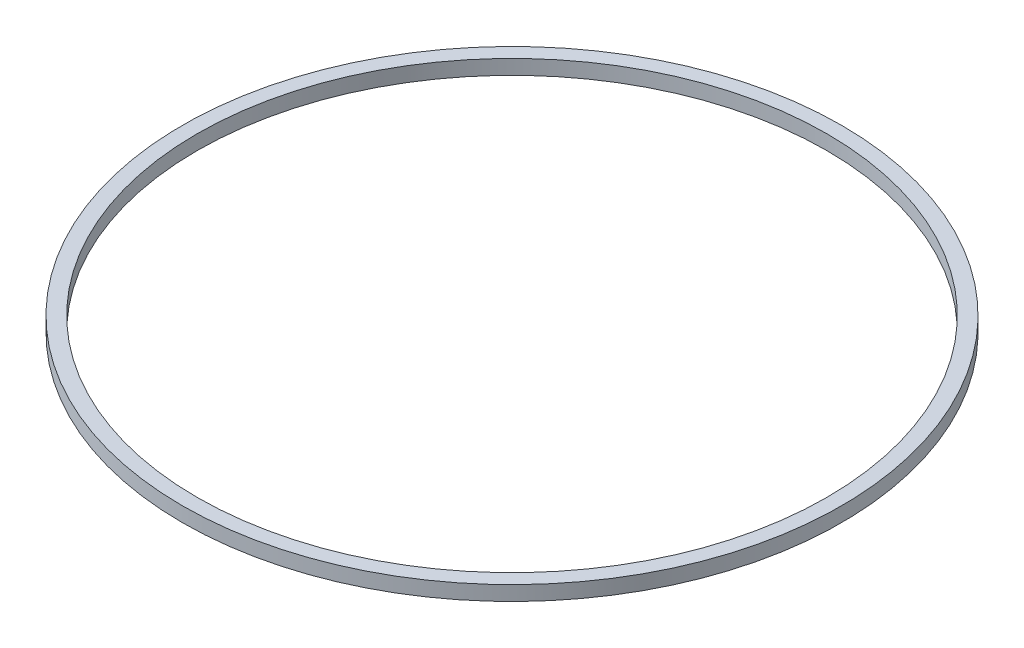
ISO-10303-21;
HEADER;
FILE_DESCRIPTION(('STEP AP214'),'2;1');
FILE_NAME('part.step','',(''),(''),'','','');
FILE_SCHEMA(('AUTOMOTIVE_DESIGN { 1 0 10303 214 1 1 1 1 }'));
ENDSEC;
DATA;
#1=APPLICATION_CONTEXT('core data for automotive mechanical design processes');
#2=APPLICATION_PROTOCOL_DEFINITION('international standard','automotive_design',2000,#1);
#3=PRODUCT_CONTEXT('',#1,'mechanical');
#4=PRODUCT('Part','Part','',(#3));
#5=PRODUCT_RELATED_PRODUCT_CATEGORY('part','',(#4));
#6=PRODUCT_DEFINITION_FORMATION('','',#4);
#7=PRODUCT_DEFINITION_CONTEXT('part definition',#1,'design');
#8=PRODUCT_DEFINITION('design','',#6,#7);
#9=PRODUCT_DEFINITION_SHAPE('','',#8);
#10=(LENGTH_UNIT() NAMED_UNIT(*) SI_UNIT(.MILLI.,.METRE.));
#11=(NAMED_UNIT(*) PLANE_ANGLE_UNIT() SI_UNIT($,.RADIAN.));
#12=(NAMED_UNIT(*) SI_UNIT($,.STERADIAN.) SOLID_ANGLE_UNIT());
#13=UNCERTAINTY_MEASURE_WITH_UNIT(LENGTH_MEASURE(1.E-05),#10,'distance_accuracy_value','');
#14=(GEOMETRIC_REPRESENTATION_CONTEXT(3) GLOBAL_UNCERTAINTY_ASSIGNED_CONTEXT((#13)) GLOBAL_UNIT_ASSIGNED_CONTEXT((#10,
#11,#12)) REPRESENTATION_CONTEXT('',''));
#15=CARTESIAN_POINT('',(0.,0.,0.));
#16=DIRECTION('',(0.,0.,1.));
#17=DIRECTION('',(1.,0.,0.));
#18=AXIS2_PLACEMENT_3D('',#15,#16,#17);
#19=CARTESIAN_POINT('',(0.,10.,0.));
#20=DIRECTION('',(0.,-1.,0.));
#21=DIRECTION('',(0.,0.,-1.));
#22=AXIS2_PLACEMENT_3D('',#19,#20,#21);
#23=CYLINDRICAL_SURFACE('',#22,225.);
#24=CARTESIAN_POINT('',(0.,10.,0.));
#25=DIRECTION('',(0.,1.,0.));
#26=DIRECTION('',(0.,0.,1.));
#27=AXIS2_PLACEMENT_3D('',#24,#25,#26);
#28=CIRCLE('',#27,225.);
#29=CARTESIAN_POINT('',(0.,10.,225.));
#30=VERTEX_POINT('',#29);
#31=EDGE_CURVE('E10',#30,#30,#28,.T.);
#32=ORIENTED_EDGE('',*,*,#31,.F.);
#33=EDGE_LOOP('',(#32));
#34=FACE_BOUND('',#33,.T.);
#35=CARTESIAN_POINT('',(0.,0.,0.));
#36=DIRECTION('',(0.,1.,0.));
#37=DIRECTION('',(0.,0.,1.));
#38=AXIS2_PLACEMENT_3D('',#35,#36,#37);
#39=CIRCLE('',#38,225.);
#40=CARTESIAN_POINT('',(0.,0.,225.));
#41=VERTEX_POINT('',#40);
#42=EDGE_CURVE('E37',#41,#41,#39,.T.);
#43=ORIENTED_EDGE('',*,*,#42,.T.);
#44=EDGE_LOOP('',(#43));
#45=FACE_BOUND('',#44,.T.);
#46=ADVANCED_FACE('F40',(#34,#45),#23,.T.);
#47=CARTESIAN_POINT('',(0.,10.,0.));
#48=DIRECTION('',(0.,1.,0.));
#49=DIRECTION('',(0.,0.,1.));
#50=AXIS2_PLACEMENT_3D('',#47,#48,#49);
#51=PLANE('',#50);
#52=CARTESIAN_POINT('',(0.,10.,0.));
#53=DIRECTION('',(0.,1.,0.));
#54=DIRECTION('',(0.,0.,1.));
#55=AXIS2_PLACEMENT_3D('',#52,#53,#54);
#56=CIRCLE('',#55,215.);
#57=CARTESIAN_POINT('',(0.,10.,215.));
#58=VERTEX_POINT('',#57);
#59=EDGE_CURVE('E47',#58,#58,#56,.T.);
#60=ORIENTED_EDGE('',*,*,#59,.F.);
#61=EDGE_LOOP('',(#60));
#62=FACE_BOUND('',#61,.T.);
#63=ORIENTED_EDGE('',*,*,#31,.T.);
#64=EDGE_LOOP('',(#63));
#65=FACE_BOUND('',#64,.T.);
#66=ADVANCED_FACE('F64',(#62,#65),#51,.T.);
#67=CARTESIAN_POINT('',(0.,0.,0.));
#68=DIRECTION('',(0.,1.,0.));
#69=DIRECTION('',(0.,0.,1.));
#70=AXIS2_PLACEMENT_3D('',#67,#68,#69);
#71=PLANE('',#70);
#72=CARTESIAN_POINT('',(0.,0.,0.));
#73=DIRECTION('',(0.,1.,0.));
#74=DIRECTION('',(0.,0.,1.));
#75=AXIS2_PLACEMENT_3D('',#72,#73,#74);
#76=CIRCLE('',#75,215.);
#77=CARTESIAN_POINT('',(0.,0.,215.));
#78=VERTEX_POINT('',#77);
#79=EDGE_CURVE('E50',#78,#78,#76,.T.);
#80=ORIENTED_EDGE('',*,*,#79,.T.);
#81=EDGE_LOOP('',(#80));
#82=FACE_BOUND('',#81,.T.);
#83=ORIENTED_EDGE('',*,*,#42,.F.);
#84=EDGE_LOOP('',(#83));
#85=FACE_BOUND('',#84,.T.);
#86=ADVANCED_FACE('F54',(#82,#85),#71,.F.);
#87=CARTESIAN_POINT('',(0.,0.,0.));
#88=DIRECTION('',(0.,1.,0.));
#89=DIRECTION('',(0.,0.,1.));
#90=AXIS2_PLACEMENT_3D('',#87,#88,#89);
#91=CYLINDRICAL_SURFACE('',#90,215.);
#92=ORIENTED_EDGE('',*,*,#79,.F.);
#93=EDGE_LOOP('',(#92));
#94=FACE_BOUND('',#93,.T.);
#95=ORIENTED_EDGE('',*,*,#59,.T.);
#96=EDGE_LOOP('',(#95));
#97=FACE_BOUND('',#96,.T.);
#98=ADVANCED_FACE('F59',(#94,#97),#91,.F.);
#99=CLOSED_SHELL('',(#46,#66,#86,#98));
#100=MANIFOLD_SOLID_BREP('B2',#99);
#101=ADVANCED_BREP_SHAPE_REPRESENTATION('',(#18,#100),#14);
#102=SHAPE_DEFINITION_REPRESENTATION(#9,#101);
ENDSEC;
END-ISO-10303-21;
